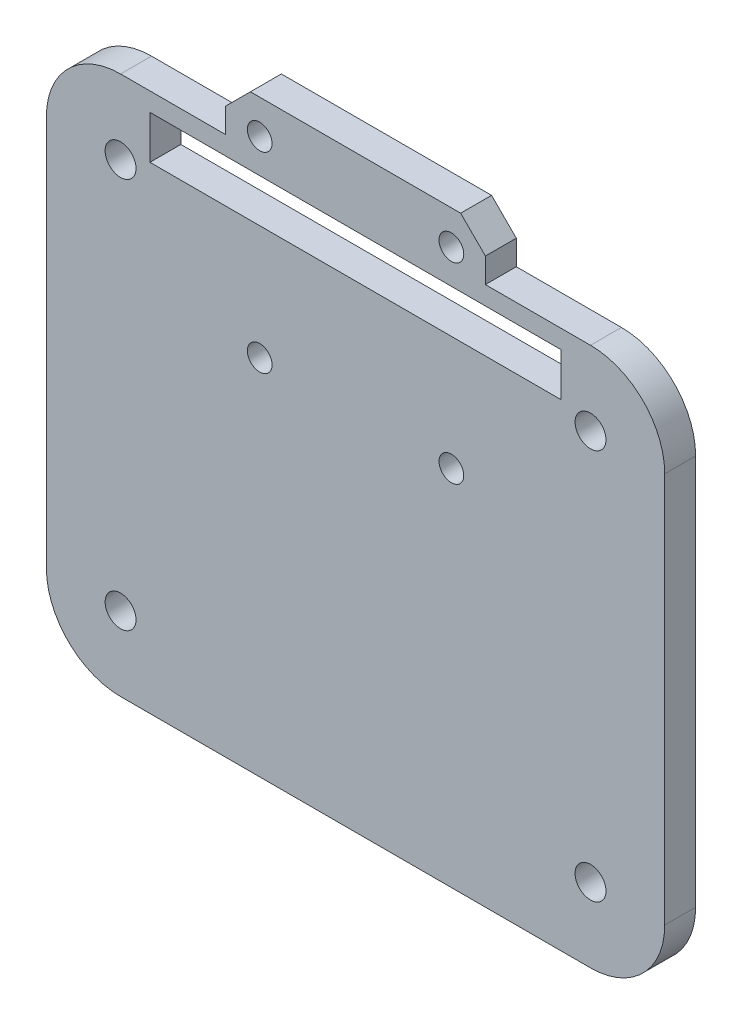
ISO-10303-21;
HEADER;
FILE_DESCRIPTION(('STEP AP214'),'2;1');
FILE_NAME('part.step','',(''),(''),'','','');
FILE_SCHEMA(('AUTOMOTIVE_DESIGN { 1 0 10303 214 1 1 1 1 }'));
ENDSEC;
DATA;
#1=APPLICATION_CONTEXT('core data for automotive mechanical design processes');
#2=APPLICATION_PROTOCOL_DEFINITION('international standard','automotive_design',2000,#1);
#3=PRODUCT_CONTEXT('',#1,'mechanical');
#4=PRODUCT('Part','Part','',(#3));
#5=PRODUCT_RELATED_PRODUCT_CATEGORY('part','',(#4));
#6=PRODUCT_DEFINITION_FORMATION('','',#4);
#7=PRODUCT_DEFINITION_CONTEXT('part definition',#1,'design');
#8=PRODUCT_DEFINITION('design','',#6,#7);
#9=PRODUCT_DEFINITION_SHAPE('','',#8);
#10=(LENGTH_UNIT() NAMED_UNIT(*) SI_UNIT(.MILLI.,.METRE.));
#11=(NAMED_UNIT(*) PLANE_ANGLE_UNIT() SI_UNIT($,.RADIAN.));
#12=(NAMED_UNIT(*) SI_UNIT($,.STERADIAN.) SOLID_ANGLE_UNIT());
#13=UNCERTAINTY_MEASURE_WITH_UNIT(LENGTH_MEASURE(1.E-05),#10,'distance_accuracy_value','');
#14=(GEOMETRIC_REPRESENTATION_CONTEXT(3) GLOBAL_UNCERTAINTY_ASSIGNED_CONTEXT((#13)) GLOBAL_UNIT_ASSIGNED_CONTEXT((#10,
#11,#12)) REPRESENTATION_CONTEXT('',''));
#15=CARTESIAN_POINT('',(0.,0.,0.));
#16=DIRECTION('',(0.,0.,1.));
#17=DIRECTION('',(1.,0.,0.));
#18=AXIS2_PLACEMENT_3D('',#15,#16,#17);
#19=CARTESIAN_POINT('',(50.,-43.6,5.));
#20=DIRECTION('',(-1.,0.,0.));
#21=DIRECTION('',(0.,0.,1.));
#22=AXIS2_PLACEMENT_3D('',#19,#20,#21);
#23=PLANE('',#22);
#24=DIRECTION('',(0.,1.,0.));
#25=VECTOR('',#24,1.);
#26=CARTESIAN_POINT('',(50.,-43.6,5.));
#27=LINE('',#26,#25);
#28=CARTESIAN_POINT('',(50.,-31.6,5.));
#29=VERTEX_POINT('',#28);
#30=CARTESIAN_POINT('',(50.,31.6,5.));
#31=VERTEX_POINT('',#30);
#32=EDGE_CURVE('E229',#29,#31,#27,.T.);
#33=ORIENTED_EDGE('',*,*,#32,.F.);
#34=DIRECTION('',(0.,0.,-1.));
#35=VECTOR('',#34,1.);
#36=CARTESIAN_POINT('',(50.,-31.6,5.));
#37=LINE('',#36,#35);
#38=CARTESIAN_POINT('',(50.,-31.6,0.));
#39=VERTEX_POINT('',#38);
#40=EDGE_CURVE('E340',#29,#39,#37,.T.);
#41=ORIENTED_EDGE('',*,*,#40,.T.);
#42=DIRECTION('',(0.,1.,0.));
#43=VECTOR('',#42,1.);
#44=CARTESIAN_POINT('',(50.,-43.6,0.));
#45=LINE('',#44,#43);
#46=CARTESIAN_POINT('',(50.,31.6,0.));
#47=VERTEX_POINT('',#46);
#48=EDGE_CURVE('E253',#39,#47,#45,.T.);
#49=ORIENTED_EDGE('',*,*,#48,.T.);
#50=DIRECTION('',(0.,0.,-1.));
#51=VECTOR('',#50,1.);
#52=CARTESIAN_POINT('',(50.,31.6,5.));
#53=LINE('',#52,#51);
#54=EDGE_CURVE('E338',#47,#31,#53,.F.);
#55=ORIENTED_EDGE('',*,*,#54,.T.);
#56=EDGE_LOOP('',(#33,#41,#49,#55));
#57=FACE_BOUND('',#56,.T.);
#58=ADVANCED_FACE('F33',(#57),#23,.F.);
#59=CARTESIAN_POINT('',(21.,43.6,5.));
#60=DIRECTION('',(0.,-1.,0.));
#61=DIRECTION('',(0.,0.,-1.));
#62=AXIS2_PLACEMENT_3D('',#59,#60,#61);
#63=PLANE('',#62);
#64=DIRECTION('',(-1.,0.,0.));
#65=VECTOR('',#64,1.);
#66=CARTESIAN_POINT('',(21.,43.6,5.));
#67=LINE('',#66,#65);
#68=CARTESIAN_POINT('',(38.,43.6,5.));
#69=VERTEX_POINT('',#68);
#70=CARTESIAN_POINT('',(21.,43.6,5.));
#71=VERTEX_POINT('',#70);
#72=EDGE_CURVE('E231',#69,#71,#67,.T.);
#73=ORIENTED_EDGE('',*,*,#72,.F.);
#74=DIRECTION('',(0.,0.,-1.));
#75=VECTOR('',#74,1.);
#76=CARTESIAN_POINT('',(38.,43.6,5.));
#77=LINE('',#76,#75);
#78=CARTESIAN_POINT('',(38.,43.6,0.));
#79=VERTEX_POINT('',#78);
#80=EDGE_CURVE('E41',#69,#79,#77,.T.);
#81=ORIENTED_EDGE('',*,*,#80,.T.);
#82=DIRECTION('',(-1.,0.,0.));
#83=VECTOR('',#82,1.);
#84=CARTESIAN_POINT('',(21.,43.6,0.));
#85=LINE('',#84,#83);
#86=CARTESIAN_POINT('',(21.,43.6,0.));
#87=VERTEX_POINT('',#86);
#88=EDGE_CURVE('E256',#79,#87,#85,.T.);
#89=ORIENTED_EDGE('',*,*,#88,.T.);
#90=DIRECTION('',(0.,0.,-1.));
#91=VECTOR('',#90,1.);
#92=CARTESIAN_POINT('',(21.,43.6,5.));
#93=LINE('',#92,#91);
#94=EDGE_CURVE('E289',#71,#87,#93,.T.);
#95=ORIENTED_EDGE('',*,*,#94,.F.);
#96=EDGE_LOOP('',(#73,#81,#89,#95));
#97=FACE_BOUND('',#96,.T.);
#98=ADVANCED_FACE('F346',(#97),#63,.F.);
#99=CARTESIAN_POINT('',(21.,43.6,5.));
#100=DIRECTION('',(-1.,0.,0.));
#101=DIRECTION('',(0.,0.,1.));
#102=AXIS2_PLACEMENT_3D('',#99,#100,#101);
#103=PLANE('',#102);
#104=DIRECTION('',(0.,1.,0.));
#105=VECTOR('',#104,1.);
#106=CARTESIAN_POINT('',(21.,43.6,0.));
#107=LINE('',#106,#105);
#108=CARTESIAN_POINT('',(21.,47.6,0.));
#109=VERTEX_POINT('',#108);
#110=EDGE_CURVE('E258',#87,#109,#107,.T.);
#111=ORIENTED_EDGE('',*,*,#110,.T.);
#112=DIRECTION('',(0.,0.,-1.));
#113=VECTOR('',#112,1.);
#114=CARTESIAN_POINT('',(21.,47.6,5.));
#115=LINE('',#114,#113);
#116=CARTESIAN_POINT('',(21.,47.6,5.));
#117=VERTEX_POINT('',#116);
#118=EDGE_CURVE('E286',#117,#109,#115,.T.);
#119=ORIENTED_EDGE('',*,*,#118,.F.);
#120=DIRECTION('',(0.,1.,0.));
#121=VECTOR('',#120,1.);
#122=CARTESIAN_POINT('',(21.,43.6,5.));
#123=LINE('',#122,#121);
#124=EDGE_CURVE('E234',#71,#117,#123,.T.);
#125=ORIENTED_EDGE('',*,*,#124,.F.);
#126=ORIENTED_EDGE('',*,*,#94,.T.);
#127=EDGE_LOOP('',(#111,#119,#125,#126));
#128=FACE_BOUND('',#127,.T.);
#129=ADVANCED_FACE('F357',(#128),#103,.F.);
#130=CARTESIAN_POINT('',(21.,47.6,5.));
#131=DIRECTION('',(-0.707106781186547,-0.707106781186548,0.));
#132=DIRECTION('',(0.707106781186548,-0.707106781186547,0.));
#133=AXIS2_PLACEMENT_3D('',#130,#131,#132);
#134=PLANE('',#133);
#135=DIRECTION('',(-0.707106781186548,0.707106781186547,0.));
#136=VECTOR('',#135,1.);
#137=CARTESIAN_POINT('',(21.,47.6,0.));
#138=LINE('',#137,#136);
#139=CARTESIAN_POINT('',(17.,51.6,0.));
#140=VERTEX_POINT('',#139);
#141=EDGE_CURVE('E260',#109,#140,#138,.T.);
#142=ORIENTED_EDGE('',*,*,#141,.T.);
#143=DIRECTION('',(0.,0.,-1.));
#144=VECTOR('',#143,1.);
#145=CARTESIAN_POINT('',(17.,51.6,5.));
#146=LINE('',#145,#144);
#147=CARTESIAN_POINT('',(17.,51.6,5.));
#148=VERTEX_POINT('',#147);
#149=EDGE_CURVE('E283',#148,#140,#146,.T.);
#150=ORIENTED_EDGE('',*,*,#149,.F.);
#151=DIRECTION('',(-0.707106781186548,0.707106781186547,0.));
#152=VECTOR('',#151,1.);
#153=CARTESIAN_POINT('',(21.,47.6,5.));
#154=LINE('',#153,#152);
#155=EDGE_CURVE('E236',#117,#148,#154,.T.);
#156=ORIENTED_EDGE('',*,*,#155,.F.);
#157=ORIENTED_EDGE('',*,*,#118,.T.);
#158=EDGE_LOOP('',(#142,#150,#156,#157));
#159=FACE_BOUND('',#158,.T.);
#160=ADVANCED_FACE('F361',(#159),#134,.F.);
#161=CARTESIAN_POINT('',(-17.,51.6,5.));
#162=DIRECTION('',(0.,-1.,0.));
#163=DIRECTION('',(0.,0.,-1.));
#164=AXIS2_PLACEMENT_3D('',#161,#162,#163);
#165=PLANE('',#164);
#166=DIRECTION('',(-1.,0.,0.));
#167=VECTOR('',#166,1.);
#168=CARTESIAN_POINT('',(-17.,51.6,0.));
#169=LINE('',#168,#167);
#170=CARTESIAN_POINT('',(-17.,51.6,0.));
#171=VERTEX_POINT('',#170);
#172=EDGE_CURVE('E262',#140,#171,#169,.T.);
#173=ORIENTED_EDGE('',*,*,#172,.T.);
#174=DIRECTION('',(0.,0.,-1.));
#175=VECTOR('',#174,1.);
#176=CARTESIAN_POINT('',(-17.,51.6,5.));
#177=LINE('',#176,#175);
#178=CARTESIAN_POINT('',(-17.,51.6,5.));
#179=VERTEX_POINT('',#178);
#180=EDGE_CURVE('E280',#179,#171,#177,.T.);
#181=ORIENTED_EDGE('',*,*,#180,.F.);
#182=DIRECTION('',(-1.,0.,0.));
#183=VECTOR('',#182,1.);
#184=CARTESIAN_POINT('',(-17.,51.6,5.));
#185=LINE('',#184,#183);
#186=EDGE_CURVE('E238',#148,#179,#185,.T.);
#187=ORIENTED_EDGE('',*,*,#186,.F.);
#188=ORIENTED_EDGE('',*,*,#149,.T.);
#189=EDGE_LOOP('',(#173,#181,#187,#188));
#190=FACE_BOUND('',#189,.T.);
#191=ADVANCED_FACE('F369',(#190),#165,.F.);
#192=CARTESIAN_POINT('',(-21.,47.6,5.));
#193=DIRECTION('',(0.707106781186547,-0.707106781186548,0.));
#194=DIRECTION('',(0.707106781186548,0.707106781186547,0.));
#195=AXIS2_PLACEMENT_3D('',#192,#193,#194);
#196=PLANE('',#195);
#197=DIRECTION('',(-0.707106781186548,-0.707106781186547,0.));
#198=VECTOR('',#197,1.);
#199=CARTESIAN_POINT('',(-21.,47.6,0.));
#200=LINE('',#199,#198);
#201=CARTESIAN_POINT('',(-21.,47.6,0.));
#202=VERTEX_POINT('',#201);
#203=EDGE_CURVE('E264',#171,#202,#200,.T.);
#204=ORIENTED_EDGE('',*,*,#203,.T.);
#205=DIRECTION('',(0.,0.,-1.));
#206=VECTOR('',#205,1.);
#207=CARTESIAN_POINT('',(-21.,47.6,5.));
#208=LINE('',#207,#206);
#209=CARTESIAN_POINT('',(-21.,47.6,5.));
#210=VERTEX_POINT('',#209);
#211=EDGE_CURVE('E277',#210,#202,#208,.T.);
#212=ORIENTED_EDGE('',*,*,#211,.F.);
#213=DIRECTION('',(-0.707106781186548,-0.707106781186547,0.));
#214=VECTOR('',#213,1.);
#215=CARTESIAN_POINT('',(-21.,47.6,5.));
#216=LINE('',#215,#214);
#217=EDGE_CURVE('E240',#179,#210,#216,.T.);
#218=ORIENTED_EDGE('',*,*,#217,.F.);
#219=ORIENTED_EDGE('',*,*,#180,.T.);
#220=EDGE_LOOP('',(#204,#212,#218,#219));
#221=FACE_BOUND('',#220,.T.);
#222=ADVANCED_FACE('F372',(#221),#196,.F.);
#223=CARTESIAN_POINT('',(-21.,43.6,5.));
#224=DIRECTION('',(1.,0.,0.));
#225=DIRECTION('',(0.,0.,-1.));
#226=AXIS2_PLACEMENT_3D('',#223,#224,#225);
#227=PLANE('',#226);
#228=DIRECTION('',(0.,-1.,0.));
#229=VECTOR('',#228,1.);
#230=CARTESIAN_POINT('',(-21.,43.6,0.));
#231=LINE('',#230,#229);
#232=CARTESIAN_POINT('',(-21.,43.6,0.));
#233=VERTEX_POINT('',#232);
#234=EDGE_CURVE('E266',#202,#233,#231,.T.);
#235=ORIENTED_EDGE('',*,*,#234,.T.);
#236=DIRECTION('',(0.,0.,-1.));
#237=VECTOR('',#236,1.);
#238=CARTESIAN_POINT('',(-21.,43.6,5.));
#239=LINE('',#238,#237);
#240=CARTESIAN_POINT('',(-21.,43.6,5.));
#241=VERTEX_POINT('',#240);
#242=EDGE_CURVE('E252',#241,#233,#239,.T.);
#243=ORIENTED_EDGE('',*,*,#242,.F.);
#244=DIRECTION('',(0.,-1.,0.));
#245=VECTOR('',#244,1.);
#246=CARTESIAN_POINT('',(-21.,43.6,5.));
#247=LINE('',#246,#245);
#248=EDGE_CURVE('E242',#210,#241,#247,.T.);
#249=ORIENTED_EDGE('',*,*,#248,.F.);
#250=ORIENTED_EDGE('',*,*,#211,.T.);
#251=EDGE_LOOP('',(#235,#243,#249,#250));
#252=FACE_BOUND('',#251,.T.);
#253=ADVANCED_FACE('F377',(#252),#227,.F.);
#254=CARTESIAN_POINT('',(-50.,43.6,5.));
#255=DIRECTION('',(0.,-1.,0.));
#256=DIRECTION('',(0.,0.,-1.));
#257=AXIS2_PLACEMENT_3D('',#254,#255,#256);
#258=PLANE('',#257);
#259=DIRECTION('',(-1.,0.,0.));
#260=VECTOR('',#259,1.);
#261=CARTESIAN_POINT('',(-50.,43.6,0.));
#262=LINE('',#261,#260);
#263=CARTESIAN_POINT('',(-38.,43.6,0.));
#264=VERTEX_POINT('',#263);
#265=EDGE_CURVE('E268',#233,#264,#262,.T.);
#266=ORIENTED_EDGE('',*,*,#265,.T.);
#267=DIRECTION('',(0.,0.,-1.));
#268=VECTOR('',#267,1.);
#269=CARTESIAN_POINT('',(-38.,43.6,5.));
#270=LINE('',#269,#268);
#271=CARTESIAN_POINT('',(-38.,43.6,5.));
#272=VERTEX_POINT('',#271);
#273=EDGE_CURVE('E11',#264,#272,#270,.F.);
#274=ORIENTED_EDGE('',*,*,#273,.T.);
#275=DIRECTION('',(-1.,0.,0.));
#276=VECTOR('',#275,1.);
#277=CARTESIAN_POINT('',(-50.,43.6,5.));
#278=LINE('',#277,#276);
#279=EDGE_CURVE('E244',#241,#272,#278,.T.);
#280=ORIENTED_EDGE('',*,*,#279,.F.);
#281=ORIENTED_EDGE('',*,*,#242,.T.);
#282=EDGE_LOOP('',(#266,#274,#280,#281));
#283=FACE_BOUND('',#282,.T.);
#284=ADVANCED_FACE('F474',(#283),#258,.F.);
#285=CARTESIAN_POINT('',(-50.,-43.6,5.));
#286=DIRECTION('',(1.,0.,0.));
#287=DIRECTION('',(0.,0.,-1.));
#288=AXIS2_PLACEMENT_3D('',#285,#286,#287);
#289=PLANE('',#288);
#290=DIRECTION('',(0.,-1.,0.));
#291=VECTOR('',#290,1.);
#292=CARTESIAN_POINT('',(-50.,-43.6,0.));
#293=LINE('',#292,#291);
#294=CARTESIAN_POINT('',(-50.,31.6,0.));
#295=VERTEX_POINT('',#294);
#296=CARTESIAN_POINT('',(-50.,-31.6,0.));
#297=VERTEX_POINT('',#296);
#298=EDGE_CURVE('E270',#295,#297,#293,.T.);
#299=ORIENTED_EDGE('',*,*,#298,.T.);
#300=DIRECTION('',(0.,0.,-1.));
#301=VECTOR('',#300,1.);
#302=CARTESIAN_POINT('',(-50.,-31.6,5.));
#303=LINE('',#302,#301);
#304=CARTESIAN_POINT('',(-50.,-31.6,5.));
#305=VERTEX_POINT('',#304);
#306=EDGE_CURVE('E329',#297,#305,#303,.F.);
#307=ORIENTED_EDGE('',*,*,#306,.T.);
#308=DIRECTION('',(0.,-1.,0.));
#309=VECTOR('',#308,1.);
#310=CARTESIAN_POINT('',(-50.,-43.6,5.));
#311=LINE('',#310,#309);
#312=CARTESIAN_POINT('',(-50.,31.6,5.));
#313=VERTEX_POINT('',#312);
#314=EDGE_CURVE('E246',#313,#305,#311,.T.);
#315=ORIENTED_EDGE('',*,*,#314,.F.);
#316=DIRECTION('',(0.,0.,-1.));
#317=VECTOR('',#316,1.);
#318=CARTESIAN_POINT('',(-50.,31.6,5.));
#319=LINE('',#318,#317);
#320=EDGE_CURVE('E326',#313,#295,#319,.T.);
#321=ORIENTED_EDGE('',*,*,#320,.T.);
#322=EDGE_LOOP('',(#299,#307,#315,#321));
#323=FACE_BOUND('',#322,.T.);
#324=ADVANCED_FACE('F384',(#323),#289,.F.);
#325=CARTESIAN_POINT('',(-50.,-43.6,5.));
#326=DIRECTION('',(0.,1.,0.));
#327=DIRECTION('',(0.,0.,1.));
#328=AXIS2_PLACEMENT_3D('',#325,#326,#327);
#329=PLANE('',#328);
#330=DIRECTION('',(1.,0.,0.));
#331=VECTOR('',#330,1.);
#332=CARTESIAN_POINT('',(-50.,-43.6,5.));
#333=LINE('',#332,#331);
#334=CARTESIAN_POINT('',(-38.,-43.6,5.));
#335=VERTEX_POINT('',#334);
#336=CARTESIAN_POINT('',(38.,-43.6,5.));
#337=VERTEX_POINT('',#336);
#338=EDGE_CURVE('E249',#335,#337,#333,.T.);
#339=ORIENTED_EDGE('',*,*,#338,.F.);
#340=DIRECTION('',(0.,0.,-1.));
#341=VECTOR('',#340,1.);
#342=CARTESIAN_POINT('',(-38.,-43.6,5.));
#343=LINE('',#342,#341);
#344=CARTESIAN_POINT('',(-38.,-43.6,0.));
#345=VERTEX_POINT('',#344);
#346=EDGE_CURVE('E315',#335,#345,#343,.T.);
#347=ORIENTED_EDGE('',*,*,#346,.T.);
#348=DIRECTION('',(1.,0.,0.));
#349=VECTOR('',#348,1.);
#350=CARTESIAN_POINT('',(-50.,-43.6,0.));
#351=LINE('',#350,#349);
#352=CARTESIAN_POINT('',(38.,-43.6,0.));
#353=VERTEX_POINT('',#352);
#354=EDGE_CURVE('E232',#345,#353,#351,.T.);
#355=ORIENTED_EDGE('',*,*,#354,.T.);
#356=DIRECTION('',(0.,0.,-1.));
#357=VECTOR('',#356,1.);
#358=CARTESIAN_POINT('',(38.,-43.6,5.));
#359=LINE('',#358,#357);
#360=EDGE_CURVE('E292',#353,#337,#359,.F.);
#361=ORIENTED_EDGE('',*,*,#360,.T.);
#362=EDGE_LOOP('',(#339,#347,#355,#361));
#363=FACE_BOUND('',#362,.T.);
#364=ADVANCED_FACE('F393',(#363),#329,.F.);
#365=CARTESIAN_POINT('',(0.,0.,5.));
#366=DIRECTION('',(0.,0.,-1.));
#367=DIRECTION('',(-1.,0.,0.));
#368=AXIS2_PLACEMENT_3D('',#365,#366,#367);
#369=PLANE('',#368);
#370=DIRECTION('',(-1.,0.,0.));
#371=VECTOR('',#370,1.);
#372=CARTESIAN_POINT('',(-33.25,40.6,5.));
#373=LINE('',#372,#371);
#374=CARTESIAN_POINT('',(33.25,40.6,5.));
#375=VERTEX_POINT('',#374);
#376=CARTESIAN_POINT('',(-33.25,40.6,5.));
#377=VERTEX_POINT('',#376);
#378=EDGE_CURVE('E193',#375,#377,#373,.T.);
#379=ORIENTED_EDGE('',*,*,#378,.F.);
#380=DIRECTION('',(0.,1.,0.));
#381=VECTOR('',#380,1.);
#382=CARTESIAN_POINT('',(33.25,40.6,5.));
#383=LINE('',#382,#381);
#384=CARTESIAN_POINT('',(33.25,33.6,5.));
#385=VERTEX_POINT('',#384);
#386=EDGE_CURVE('E166',#385,#375,#383,.T.);
#387=ORIENTED_EDGE('',*,*,#386,.F.);
#388=DIRECTION('',(1.,0.,0.));
#389=VECTOR('',#388,1.);
#390=CARTESIAN_POINT('',(-33.25,33.6,5.));
#391=LINE('',#390,#389);
#392=CARTESIAN_POINT('',(-33.25,33.6,5.));
#393=VERTEX_POINT('',#392);
#394=EDGE_CURVE('E184',#393,#385,#391,.T.);
#395=ORIENTED_EDGE('',*,*,#394,.F.);
#396=DIRECTION('',(0.,-1.,0.));
#397=VECTOR('',#396,1.);
#398=CARTESIAN_POINT('',(-33.25,40.6,5.));
#399=LINE('',#398,#397);
#400=EDGE_CURVE('E187',#377,#393,#399,.T.);
#401=ORIENTED_EDGE('',*,*,#400,.F.);
#402=EDGE_LOOP('',(#379,#387,#395,#401));
#403=FACE_BOUND('',#402,.T.);
#404=CARTESIAN_POINT('',(-38.,-31.6,5.));
#405=DIRECTION('',(0.,0.,1.));
#406=DIRECTION('',(1.,0.,0.));
#407=AXIS2_PLACEMENT_3D('',#404,#405,#406);
#408=CIRCLE('',#407,2.5);
#409=CARTESIAN_POINT('',(-35.5,-31.6,5.));
#410=VERTEX_POINT('',#409);
#411=EDGE_CURVE('E199',#410,#410,#408,.T.);
#412=ORIENTED_EDGE('',*,*,#411,.F.);
#413=EDGE_LOOP('',(#412));
#414=FACE_BOUND('',#413,.T.);
#415=CARTESIAN_POINT('',(-38.,31.6,5.));
#416=DIRECTION('',(0.,0.,1.));
#417=DIRECTION('',(1.,0.,0.));
#418=AXIS2_PLACEMENT_3D('',#415,#416,#417);
#419=CIRCLE('',#418,2.5);
#420=CARTESIAN_POINT('',(-35.5,31.6,5.));
#421=VERTEX_POINT('',#420);
#422=EDGE_CURVE('E210',#421,#421,#419,.T.);
#423=ORIENTED_EDGE('',*,*,#422,.F.);
#424=EDGE_LOOP('',(#423));
#425=FACE_BOUND('',#424,.T.);
#426=CARTESIAN_POINT('',(-15.5,15.1,5.));
#427=DIRECTION('',(0.,0.,1.));
#428=DIRECTION('',(1.,0.,0.));
#429=AXIS2_PLACEMENT_3D('',#426,#427,#428);
#430=CIRCLE('',#429,2.);
#431=CARTESIAN_POINT('',(-13.5,15.1,5.));
#432=VERTEX_POINT('',#431);
#433=EDGE_CURVE('E207',#432,#432,#430,.T.);
#434=ORIENTED_EDGE('',*,*,#433,.F.);
#435=EDGE_LOOP('',(#434));
#436=FACE_BOUND('',#435,.T.);
#437=CARTESIAN_POINT('',(15.5,15.1,5.));
#438=DIRECTION('',(0.,0.,1.));
#439=DIRECTION('',(1.,0.,0.));
#440=AXIS2_PLACEMENT_3D('',#437,#438,#439);
#441=CIRCLE('',#440,2.);
#442=CARTESIAN_POINT('',(17.5,15.1,5.));
#443=VERTEX_POINT('',#442);
#444=EDGE_CURVE('E203',#443,#443,#441,.T.);
#445=ORIENTED_EDGE('',*,*,#444,.F.);
#446=EDGE_LOOP('',(#445));
#447=FACE_BOUND('',#446,.T.);
#448=CARTESIAN_POINT('',(15.5,46.1,5.));
#449=DIRECTION('',(0.,0.,1.));
#450=DIRECTION('',(1.,0.,0.));
#451=AXIS2_PLACEMENT_3D('',#448,#449,#450);
#452=CIRCLE('',#451,2.);
#453=CARTESIAN_POINT('',(17.5,46.1,5.));
#454=VERTEX_POINT('',#453);
#455=EDGE_CURVE('E206',#454,#454,#452,.T.);
#456=ORIENTED_EDGE('',*,*,#455,.F.);
#457=EDGE_LOOP('',(#456));
#458=FACE_BOUND('',#457,.T.);
#459=CARTESIAN_POINT('',(-15.5,46.1,5.));
#460=DIRECTION('',(0.,0.,1.));
#461=DIRECTION('',(1.,0.,0.));
#462=AXIS2_PLACEMENT_3D('',#459,#460,#461);
#463=CIRCLE('',#462,2.);
#464=CARTESIAN_POINT('',(-13.5,46.1,5.));
#465=VERTEX_POINT('',#464);
#466=EDGE_CURVE('E219',#465,#465,#463,.T.);
#467=ORIENTED_EDGE('',*,*,#466,.F.);
#468=EDGE_LOOP('',(#467));
#469=FACE_BOUND('',#468,.T.);
#470=CARTESIAN_POINT('',(38.,31.6,5.));
#471=DIRECTION('',(0.,0.,1.));
#472=DIRECTION('',(1.,0.,0.));
#473=AXIS2_PLACEMENT_3D('',#470,#471,#472);
#474=CIRCLE('',#473,2.5);
#475=CARTESIAN_POINT('',(40.5,31.6,5.));
#476=VERTEX_POINT('',#475);
#477=EDGE_CURVE('E215',#476,#476,#474,.T.);
#478=ORIENTED_EDGE('',*,*,#477,.F.);
#479=EDGE_LOOP('',(#478));
#480=FACE_BOUND('',#479,.T.);
#481=CARTESIAN_POINT('',(38.,-31.6,5.));
#482=DIRECTION('',(0.,0.,1.));
#483=DIRECTION('',(1.,0.,0.));
#484=AXIS2_PLACEMENT_3D('',#481,#482,#483);
#485=CIRCLE('',#484,2.5);
#486=CARTESIAN_POINT('',(40.5,-31.6,5.));
#487=VERTEX_POINT('',#486);
#488=EDGE_CURVE('E224',#487,#487,#485,.T.);
#489=ORIENTED_EDGE('',*,*,#488,.F.);
#490=EDGE_LOOP('',(#489));
#491=FACE_BOUND('',#490,.T.);
#492=ORIENTED_EDGE('',*,*,#314,.T.);
#493=CARTESIAN_POINT('',(-38.,-31.6,5.));
#494=DIRECTION('',(0.,0.,-1.));
#495=DIRECTION('',(-1.,0.,0.));
#496=AXIS2_PLACEMENT_3D('',#493,#494,#495);
#497=CIRCLE('',#496,12.);
#498=EDGE_CURVE('E336',#305,#335,#497,.F.);
#499=ORIENTED_EDGE('',*,*,#498,.T.);
#500=ORIENTED_EDGE('',*,*,#338,.T.);
#501=CARTESIAN_POINT('',(38.,-31.6,5.));
#502=DIRECTION('',(0.,0.,-1.));
#503=DIRECTION('',(-1.,0.,0.));
#504=AXIS2_PLACEMENT_3D('',#501,#502,#503);
#505=CIRCLE('',#504,12.);
#506=EDGE_CURVE('E334',#337,#29,#505,.F.);
#507=ORIENTED_EDGE('',*,*,#506,.T.);
#508=ORIENTED_EDGE('',*,*,#32,.T.);
#509=CARTESIAN_POINT('',(38.,31.6,5.));
#510=DIRECTION('',(0.,0.,-1.));
#511=DIRECTION('',(-1.,0.,0.));
#512=AXIS2_PLACEMENT_3D('',#509,#510,#511);
#513=CIRCLE('',#512,12.);
#514=EDGE_CURVE('E54',#31,#69,#513,.F.);
#515=ORIENTED_EDGE('',*,*,#514,.T.);
#516=ORIENTED_EDGE('',*,*,#72,.T.);
#517=ORIENTED_EDGE('',*,*,#124,.T.);
#518=ORIENTED_EDGE('',*,*,#155,.T.);
#519=ORIENTED_EDGE('',*,*,#186,.T.);
#520=ORIENTED_EDGE('',*,*,#217,.T.);
#521=ORIENTED_EDGE('',*,*,#248,.T.);
#522=ORIENTED_EDGE('',*,*,#279,.T.);
#523=CARTESIAN_POINT('',(-38.,31.6,5.));
#524=DIRECTION('',(0.,0.,-1.));
#525=DIRECTION('',(-1.,0.,0.));
#526=AXIS2_PLACEMENT_3D('',#523,#524,#525);
#527=CIRCLE('',#526,12.);
#528=EDGE_CURVE('E331',#272,#313,#527,.F.);
#529=ORIENTED_EDGE('',*,*,#528,.T.);
#530=EDGE_LOOP('',(#492,#499,#500,#507,#508,#515,#516,#517,#518,#519,#520,#521,#522,#529));
#531=FACE_BOUND('',#530,.T.);
#532=ADVANCED_FACE('F364',(#403,#414,#425,#436,#447,#458,#469,#480,#491,#531),#369,.F.);
#533=CARTESIAN_POINT('',(0.,0.,0.));
#534=DIRECTION('',(0.,0.,-1.));
#535=DIRECTION('',(-1.,0.,0.));
#536=AXIS2_PLACEMENT_3D('',#533,#534,#535);
#537=PLANE('',#536);
#538=DIRECTION('',(0.,1.,0.));
#539=VECTOR('',#538,1.);
#540=CARTESIAN_POINT('',(33.25,40.6,0.));
#541=LINE('',#540,#539);
#542=CARTESIAN_POINT('',(33.25,33.6,0.));
#543=VERTEX_POINT('',#542);
#544=CARTESIAN_POINT('',(33.25,40.6,0.));
#545=VERTEX_POINT('',#544);
#546=EDGE_CURVE('E163',#543,#545,#541,.T.);
#547=ORIENTED_EDGE('',*,*,#546,.T.);
#548=DIRECTION('',(-1.,0.,0.));
#549=VECTOR('',#548,1.);
#550=CARTESIAN_POINT('',(-33.25,40.6,0.));
#551=LINE('',#550,#549);
#552=CARTESIAN_POINT('',(-33.25,40.6,0.));
#553=VERTEX_POINT('',#552);
#554=EDGE_CURVE('E175',#545,#553,#551,.T.);
#555=ORIENTED_EDGE('',*,*,#554,.T.);
#556=DIRECTION('',(0.,-1.,0.));
#557=VECTOR('',#556,1.);
#558=CARTESIAN_POINT('',(-33.25,40.6,0.));
#559=LINE('',#558,#557);
#560=CARTESIAN_POINT('',(-33.25,33.6,0.));
#561=VERTEX_POINT('',#560);
#562=EDGE_CURVE('E179',#553,#561,#559,.T.);
#563=ORIENTED_EDGE('',*,*,#562,.T.);
#564=DIRECTION('',(1.,0.,0.));
#565=VECTOR('',#564,1.);
#566=CARTESIAN_POINT('',(-33.25,33.6,0.));
#567=LINE('',#566,#565);
#568=EDGE_CURVE('E171',#561,#543,#567,.T.);
#569=ORIENTED_EDGE('',*,*,#568,.T.);
#570=EDGE_LOOP('',(#547,#555,#563,#569));
#571=FACE_BOUND('',#570,.T.);
#572=CARTESIAN_POINT('',(-38.,-31.6,0.));
#573=DIRECTION('',(0.,0.,-1.));
#574=DIRECTION('',(-1.,0.,0.));
#575=AXIS2_PLACEMENT_3D('',#572,#573,#574);
#576=CIRCLE('',#575,2.5);
#577=CARTESIAN_POINT('',(-40.5,-31.6,0.));
#578=VERTEX_POINT('',#577);
#579=EDGE_CURVE('E228',#578,#578,#576,.T.);
#580=ORIENTED_EDGE('',*,*,#579,.F.);
#581=EDGE_LOOP('',(#580));
#582=FACE_BOUND('',#581,.T.);
#583=CARTESIAN_POINT('',(-38.,31.6,0.));
#584=DIRECTION('',(0.,0.,-1.));
#585=DIRECTION('',(-1.,0.,0.));
#586=AXIS2_PLACEMENT_3D('',#583,#584,#585);
#587=CIRCLE('',#586,2.5);
#588=CARTESIAN_POINT('',(-40.5,31.6,0.));
#589=VERTEX_POINT('',#588);
#590=EDGE_CURVE('E309',#589,#589,#587,.T.);
#591=ORIENTED_EDGE('',*,*,#590,.F.);
#592=EDGE_LOOP('',(#591));
#593=FACE_BOUND('',#592,.T.);
#594=CARTESIAN_POINT('',(-15.5,15.1,0.));
#595=DIRECTION('',(0.,0.,-1.));
#596=DIRECTION('',(-1.,0.,0.));
#597=AXIS2_PLACEMENT_3D('',#594,#595,#596);
#598=CIRCLE('',#597,2.);
#599=CARTESIAN_POINT('',(-17.5,15.1,0.));
#600=VERTEX_POINT('',#599);
#601=EDGE_CURVE('E306',#600,#600,#598,.T.);
#602=ORIENTED_EDGE('',*,*,#601,.F.);
#603=EDGE_LOOP('',(#602));
#604=FACE_BOUND('',#603,.T.);
#605=CARTESIAN_POINT('',(15.5,15.1,0.));
#606=DIRECTION('',(0.,0.,-1.));
#607=DIRECTION('',(-1.,0.,0.));
#608=AXIS2_PLACEMENT_3D('',#605,#606,#607);
#609=CIRCLE('',#608,2.);
#610=CARTESIAN_POINT('',(13.5,15.1,0.));
#611=VERTEX_POINT('',#610);
#612=EDGE_CURVE('E303',#611,#611,#609,.T.);
#613=ORIENTED_EDGE('',*,*,#612,.F.);
#614=EDGE_LOOP('',(#613));
#615=FACE_BOUND('',#614,.T.);
#616=CARTESIAN_POINT('',(15.5,46.1,0.));
#617=DIRECTION('',(0.,0.,-1.));
#618=DIRECTION('',(-1.,0.,0.));
#619=AXIS2_PLACEMENT_3D('',#616,#617,#618);
#620=CIRCLE('',#619,2.);
#621=CARTESIAN_POINT('',(13.5,46.1,0.));
#622=VERTEX_POINT('',#621);
#623=EDGE_CURVE('E300',#622,#622,#620,.T.);
#624=ORIENTED_EDGE('',*,*,#623,.F.);
#625=EDGE_LOOP('',(#624));
#626=FACE_BOUND('',#625,.T.);
#627=CARTESIAN_POINT('',(-15.5,46.1,0.));
#628=DIRECTION('',(0.,0.,-1.));
#629=DIRECTION('',(-1.,0.,0.));
#630=AXIS2_PLACEMENT_3D('',#627,#628,#629);
#631=CIRCLE('',#630,2.);
#632=CARTESIAN_POINT('',(-17.5,46.1,0.));
#633=VERTEX_POINT('',#632);
#634=EDGE_CURVE('E297',#633,#633,#631,.T.);
#635=ORIENTED_EDGE('',*,*,#634,.F.);
#636=EDGE_LOOP('',(#635));
#637=FACE_BOUND('',#636,.T.);
#638=CARTESIAN_POINT('',(38.,31.6,0.));
#639=DIRECTION('',(0.,0.,-1.));
#640=DIRECTION('',(-1.,0.,0.));
#641=AXIS2_PLACEMENT_3D('',#638,#639,#640);
#642=CIRCLE('',#641,2.5);
#643=CARTESIAN_POINT('',(35.5,31.6,0.));
#644=VERTEX_POINT('',#643);
#645=EDGE_CURVE('E218',#644,#644,#642,.T.);
#646=ORIENTED_EDGE('',*,*,#645,.F.);
#647=EDGE_LOOP('',(#646));
#648=FACE_BOUND('',#647,.T.);
#649=CARTESIAN_POINT('',(38.,-31.6,0.));
#650=DIRECTION('',(0.,0.,-1.));
#651=DIRECTION('',(-1.,0.,0.));
#652=AXIS2_PLACEMENT_3D('',#649,#650,#651);
#653=CIRCLE('',#652,2.5);
#654=CARTESIAN_POINT('',(35.5,-31.6,0.));
#655=VERTEX_POINT('',#654);
#656=EDGE_CURVE('E227',#655,#655,#653,.T.);
#657=ORIENTED_EDGE('',*,*,#656,.F.);
#658=EDGE_LOOP('',(#657));
#659=FACE_BOUND('',#658,.T.);
#660=ORIENTED_EDGE('',*,*,#354,.F.);
#661=CARTESIAN_POINT('',(-38.,-31.6,0.));
#662=DIRECTION('',(0.,0.,-1.));
#663=DIRECTION('',(-1.,0.,0.));
#664=AXIS2_PLACEMENT_3D('',#661,#662,#663);
#665=CIRCLE('',#664,12.);
#666=EDGE_CURVE('E324',#345,#297,#665,.T.);
#667=ORIENTED_EDGE('',*,*,#666,.T.);
#668=ORIENTED_EDGE('',*,*,#298,.F.);
#669=CARTESIAN_POINT('',(-38.,31.6,0.));
#670=DIRECTION('',(0.,0.,-1.));
#671=DIRECTION('',(-1.,0.,0.));
#672=AXIS2_PLACEMENT_3D('',#669,#670,#671);
#673=CIRCLE('',#672,12.);
#674=EDGE_CURVE('E318',#295,#264,#673,.T.);
#675=ORIENTED_EDGE('',*,*,#674,.T.);
#676=ORIENTED_EDGE('',*,*,#265,.F.);
#677=ORIENTED_EDGE('',*,*,#234,.F.);
#678=ORIENTED_EDGE('',*,*,#203,.F.);
#679=ORIENTED_EDGE('',*,*,#172,.F.);
#680=ORIENTED_EDGE('',*,*,#141,.F.);
#681=ORIENTED_EDGE('',*,*,#110,.F.);
#682=ORIENTED_EDGE('',*,*,#88,.F.);
#683=CARTESIAN_POINT('',(38.,31.6,0.));
#684=DIRECTION('',(0.,0.,-1.));
#685=DIRECTION('',(-1.,0.,0.));
#686=AXIS2_PLACEMENT_3D('',#683,#684,#685);
#687=CIRCLE('',#686,12.);
#688=EDGE_CURVE('E320',#79,#47,#687,.T.);
#689=ORIENTED_EDGE('',*,*,#688,.T.);
#690=ORIENTED_EDGE('',*,*,#48,.F.);
#691=CARTESIAN_POINT('',(38.,-31.6,0.));
#692=DIRECTION('',(0.,0.,-1.));
#693=DIRECTION('',(-1.,0.,0.));
#694=AXIS2_PLACEMENT_3D('',#691,#692,#693);
#695=CIRCLE('',#694,12.);
#696=EDGE_CURVE('E322',#39,#353,#695,.T.);
#697=ORIENTED_EDGE('',*,*,#696,.T.);
#698=EDGE_LOOP('',(#660,#667,#668,#675,#676,#677,#678,#679,#680,#681,#682,#689,#690,#697));
#699=FACE_BOUND('',#698,.T.);
#700=ADVANCED_FACE('F181',(#571,#582,#593,#604,#615,#626,#637,#648,#659,#699),#537,.T.);
#701=CARTESIAN_POINT('',(38.,-31.6,-5.));
#702=DIRECTION('',(0.,0.,1.));
#703=DIRECTION('',(1.,0.,0.));
#704=AXIS2_PLACEMENT_3D('',#701,#702,#703);
#705=CYLINDRICAL_SURFACE('',#704,2.5);
#706=ORIENTED_EDGE('',*,*,#656,.T.);
#707=EDGE_LOOP('',(#706));
#708=FACE_BOUND('',#707,.T.);
#709=ORIENTED_EDGE('',*,*,#488,.T.);
#710=EDGE_LOOP('',(#709));
#711=FACE_BOUND('',#710,.T.);
#712=ADVANCED_FACE('F454',(#708,#711),#705,.F.);
#713=CARTESIAN_POINT('',(38.,31.6,-5.));
#714=DIRECTION('',(0.,0.,1.));
#715=DIRECTION('',(1.,0.,0.));
#716=AXIS2_PLACEMENT_3D('',#713,#714,#715);
#717=CYLINDRICAL_SURFACE('',#716,2.5);
#718=ORIENTED_EDGE('',*,*,#645,.T.);
#719=EDGE_LOOP('',(#718));
#720=FACE_BOUND('',#719,.T.);
#721=ORIENTED_EDGE('',*,*,#477,.T.);
#722=EDGE_LOOP('',(#721));
#723=FACE_BOUND('',#722,.T.);
#724=ADVANCED_FACE('F450',(#720,#723),#717,.F.);
#725=CARTESIAN_POINT('',(-15.5,46.1,-5.));
#726=DIRECTION('',(0.,0.,1.));
#727=DIRECTION('',(1.,0.,0.));
#728=AXIS2_PLACEMENT_3D('',#725,#726,#727);
#729=CYLINDRICAL_SURFACE('',#728,2.);
#730=ORIENTED_EDGE('',*,*,#634,.T.);
#731=EDGE_LOOP('',(#730));
#732=FACE_BOUND('',#731,.T.);
#733=ORIENTED_EDGE('',*,*,#466,.T.);
#734=EDGE_LOOP('',(#733));
#735=FACE_BOUND('',#734,.T.);
#736=ADVANCED_FACE('F453',(#732,#735),#729,.F.);
#737=CARTESIAN_POINT('',(15.5,46.1,-5.));
#738=DIRECTION('',(0.,0.,1.));
#739=DIRECTION('',(1.,0.,0.));
#740=AXIS2_PLACEMENT_3D('',#737,#738,#739);
#741=CYLINDRICAL_SURFACE('',#740,2.);
#742=ORIENTED_EDGE('',*,*,#623,.T.);
#743=EDGE_LOOP('',(#742));
#744=FACE_BOUND('',#743,.T.);
#745=ORIENTED_EDGE('',*,*,#455,.T.);
#746=EDGE_LOOP('',(#745));
#747=FACE_BOUND('',#746,.T.);
#748=ADVANCED_FACE('F438',(#744,#747),#741,.F.);
#749=CARTESIAN_POINT('',(15.5,15.1,-5.));
#750=DIRECTION('',(0.,0.,1.));
#751=DIRECTION('',(1.,0.,0.));
#752=AXIS2_PLACEMENT_3D('',#749,#750,#751);
#753=CYLINDRICAL_SURFACE('',#752,2.);
#754=ORIENTED_EDGE('',*,*,#612,.T.);
#755=EDGE_LOOP('',(#754));
#756=FACE_BOUND('',#755,.T.);
#757=ORIENTED_EDGE('',*,*,#444,.T.);
#758=EDGE_LOOP('',(#757));
#759=FACE_BOUND('',#758,.T.);
#760=ADVANCED_FACE('F434',(#756,#759),#753,.F.);
#761=CARTESIAN_POINT('',(-15.5,15.1,-5.));
#762=DIRECTION('',(0.,0.,1.));
#763=DIRECTION('',(1.,0.,0.));
#764=AXIS2_PLACEMENT_3D('',#761,#762,#763);
#765=CYLINDRICAL_SURFACE('',#764,2.);
#766=ORIENTED_EDGE('',*,*,#601,.T.);
#767=EDGE_LOOP('',(#766));
#768=FACE_BOUND('',#767,.T.);
#769=ORIENTED_EDGE('',*,*,#433,.T.);
#770=EDGE_LOOP('',(#769));
#771=FACE_BOUND('',#770,.T.);
#772=ADVANCED_FACE('F437',(#768,#771),#765,.F.);
#773=CARTESIAN_POINT('',(-38.,31.6,-5.));
#774=DIRECTION('',(0.,0.,1.));
#775=DIRECTION('',(1.,0.,0.));
#776=AXIS2_PLACEMENT_3D('',#773,#774,#775);
#777=CYLINDRICAL_SURFACE('',#776,2.5);
#778=ORIENTED_EDGE('',*,*,#590,.T.);
#779=EDGE_LOOP('',(#778));
#780=FACE_BOUND('',#779,.T.);
#781=ORIENTED_EDGE('',*,*,#422,.T.);
#782=EDGE_LOOP('',(#781));
#783=FACE_BOUND('',#782,.T.);
#784=ADVANCED_FACE('F442',(#780,#783),#777,.F.);
#785=CARTESIAN_POINT('',(-38.,-31.6,-5.));
#786=DIRECTION('',(0.,0.,1.));
#787=DIRECTION('',(1.,0.,0.));
#788=AXIS2_PLACEMENT_3D('',#785,#786,#787);
#789=CYLINDRICAL_SURFACE('',#788,2.5);
#790=ORIENTED_EDGE('',*,*,#579,.T.);
#791=EDGE_LOOP('',(#790));
#792=FACE_BOUND('',#791,.T.);
#793=ORIENTED_EDGE('',*,*,#411,.T.);
#794=EDGE_LOOP('',(#793));
#795=FACE_BOUND('',#794,.T.);
#796=ADVANCED_FACE('F433',(#792,#795),#789,.F.);
#797=CARTESIAN_POINT('',(33.25,40.6,0.));
#798=DIRECTION('',(1.,0.,0.));
#799=DIRECTION('',(0.,1.,0.));
#800=AXIS2_PLACEMENT_3D('',#797,#798,#799);
#801=PLANE('',#800);
#802=ORIENTED_EDGE('',*,*,#386,.T.);
#803=DIRECTION('',(0.,0.,1.));
#804=VECTOR('',#803,1.);
#805=CARTESIAN_POINT('',(33.25,40.6,0.));
#806=LINE('',#805,#804);
#807=EDGE_CURVE('E159',#545,#375,#806,.T.);
#808=ORIENTED_EDGE('',*,*,#807,.F.);
#809=ORIENTED_EDGE('',*,*,#546,.F.);
#810=DIRECTION('',(0.,0.,1.));
#811=VECTOR('',#810,1.);
#812=CARTESIAN_POINT('',(33.25,33.6,0.));
#813=LINE('',#812,#811);
#814=EDGE_CURVE('E197',#543,#385,#813,.T.);
#815=ORIENTED_EDGE('',*,*,#814,.T.);
#816=EDGE_LOOP('',(#802,#808,#809,#815));
#817=FACE_BOUND('',#816,.T.);
#818=ADVANCED_FACE('F161',(#817),#801,.F.);
#819=CARTESIAN_POINT('',(-33.25,33.6,0.));
#820=DIRECTION('',(0.,-1.,0.));
#821=DIRECTION('',(0.,0.,-1.));
#822=AXIS2_PLACEMENT_3D('',#819,#820,#821);
#823=PLANE('',#822);
#824=ORIENTED_EDGE('',*,*,#394,.T.);
#825=ORIENTED_EDGE('',*,*,#814,.F.);
#826=ORIENTED_EDGE('',*,*,#568,.F.);
#827=DIRECTION('',(0.,0.,1.));
#828=VECTOR('',#827,1.);
#829=CARTESIAN_POINT('',(-33.25,33.6,0.));
#830=LINE('',#829,#828);
#831=EDGE_CURVE('E200',#561,#393,#830,.T.);
#832=ORIENTED_EDGE('',*,*,#831,.T.);
#833=EDGE_LOOP('',(#824,#825,#826,#832));
#834=FACE_BOUND('',#833,.T.);
#835=ADVANCED_FACE('F426',(#834),#823,.F.);
#836=CARTESIAN_POINT('',(-33.25,40.6,0.));
#837=DIRECTION('',(-1.,0.,0.));
#838=DIRECTION('',(0.,-1.,0.));
#839=AXIS2_PLACEMENT_3D('',#836,#837,#838);
#840=PLANE('',#839);
#841=ORIENTED_EDGE('',*,*,#400,.T.);
#842=ORIENTED_EDGE('',*,*,#831,.F.);
#843=ORIENTED_EDGE('',*,*,#562,.F.);
#844=DIRECTION('',(0.,0.,1.));
#845=VECTOR('',#844,1.);
#846=CARTESIAN_POINT('',(-33.25,40.6,0.));
#847=LINE('',#846,#845);
#848=EDGE_CURVE('E170',#553,#377,#847,.T.);
#849=ORIENTED_EDGE('',*,*,#848,.T.);
#850=EDGE_LOOP('',(#841,#842,#843,#849));
#851=FACE_BOUND('',#850,.T.);
#852=ADVANCED_FACE('F421',(#851),#840,.F.);
#853=CARTESIAN_POINT('',(-33.25,40.6,0.));
#854=DIRECTION('',(0.,1.,0.));
#855=DIRECTION('',(0.,0.,1.));
#856=AXIS2_PLACEMENT_3D('',#853,#854,#855);
#857=PLANE('',#856);
#858=ORIENTED_EDGE('',*,*,#378,.T.);
#859=ORIENTED_EDGE('',*,*,#848,.F.);
#860=ORIENTED_EDGE('',*,*,#554,.F.);
#861=ORIENTED_EDGE('',*,*,#807,.T.);
#862=EDGE_LOOP('',(#858,#859,#860,#861));
#863=FACE_BOUND('',#862,.T.);
#864=ADVANCED_FACE('F176',(#863),#857,.F.);
#865=CARTESIAN_POINT('',(-38.,-31.6,5.));
#866=DIRECTION('',(0.,0.,-1.));
#867=DIRECTION('',(-1.,0.,0.));
#868=AXIS2_PLACEMENT_3D('',#865,#866,#867);
#869=CYLINDRICAL_SURFACE('',#868,12.);
#870=ORIENTED_EDGE('',*,*,#498,.F.);
#871=ORIENTED_EDGE('',*,*,#306,.F.);
#872=ORIENTED_EDGE('',*,*,#666,.F.);
#873=ORIENTED_EDGE('',*,*,#346,.F.);
#874=EDGE_LOOP('',(#870,#871,#872,#873));
#875=FACE_BOUND('',#874,.T.);
#876=ADVANCED_FACE('F390',(#875),#869,.T.);
#877=CARTESIAN_POINT('',(38.,-31.6,5.));
#878=DIRECTION('',(0.,0.,-1.));
#879=DIRECTION('',(-1.,0.,0.));
#880=AXIS2_PLACEMENT_3D('',#877,#878,#879);
#881=CYLINDRICAL_SURFACE('',#880,12.);
#882=ORIENTED_EDGE('',*,*,#506,.F.);
#883=ORIENTED_EDGE('',*,*,#360,.F.);
#884=ORIENTED_EDGE('',*,*,#696,.F.);
#885=ORIENTED_EDGE('',*,*,#40,.F.);
#886=EDGE_LOOP('',(#882,#883,#884,#885));
#887=FACE_BOUND('',#886,.T.);
#888=ADVANCED_FACE('F399',(#887),#881,.T.);
#889=CARTESIAN_POINT('',(38.,31.6,5.));
#890=DIRECTION('',(0.,0.,-1.));
#891=DIRECTION('',(-1.,0.,0.));
#892=AXIS2_PLACEMENT_3D('',#889,#890,#891);
#893=CYLINDRICAL_SURFACE('',#892,12.);
#894=ORIENTED_EDGE('',*,*,#514,.F.);
#895=ORIENTED_EDGE('',*,*,#54,.F.);
#896=ORIENTED_EDGE('',*,*,#688,.F.);
#897=ORIENTED_EDGE('',*,*,#80,.F.);
#898=EDGE_LOOP('',(#894,#895,#896,#897));
#899=FACE_BOUND('',#898,.T.);
#900=ADVANCED_FACE('F402',(#899),#893,.T.);
#901=CARTESIAN_POINT('',(-38.,31.6,5.));
#902=DIRECTION('',(0.,0.,-1.));
#903=DIRECTION('',(-1.,0.,0.));
#904=AXIS2_PLACEMENT_3D('',#901,#902,#903);
#905=CYLINDRICAL_SURFACE('',#904,12.);
#906=ORIENTED_EDGE('',*,*,#528,.F.);
#907=ORIENTED_EDGE('',*,*,#273,.F.);
#908=ORIENTED_EDGE('',*,*,#674,.F.);
#909=ORIENTED_EDGE('',*,*,#320,.F.);
#910=EDGE_LOOP('',(#906,#907,#908,#909));
#911=FACE_BOUND('',#910,.T.);
#912=ADVANCED_FACE('F35',(#911),#905,.T.);
#913=CLOSED_SHELL('',(#58,#98,#129,#160,#191,#222,#253,#284,#324,#364,#532,#700,#712,#724,#736,
#748,#760,#772,#784,#796,#818,#835,#852,#864,#876,#888,#900,#912));
#914=MANIFOLD_SOLID_BREP('B2',#913);
#915=ADVANCED_BREP_SHAPE_REPRESENTATION('',(#18,#914),#14);
#916=SHAPE_DEFINITION_REPRESENTATION(#9,#915);
ENDSEC;
END-ISO-10303-21;
